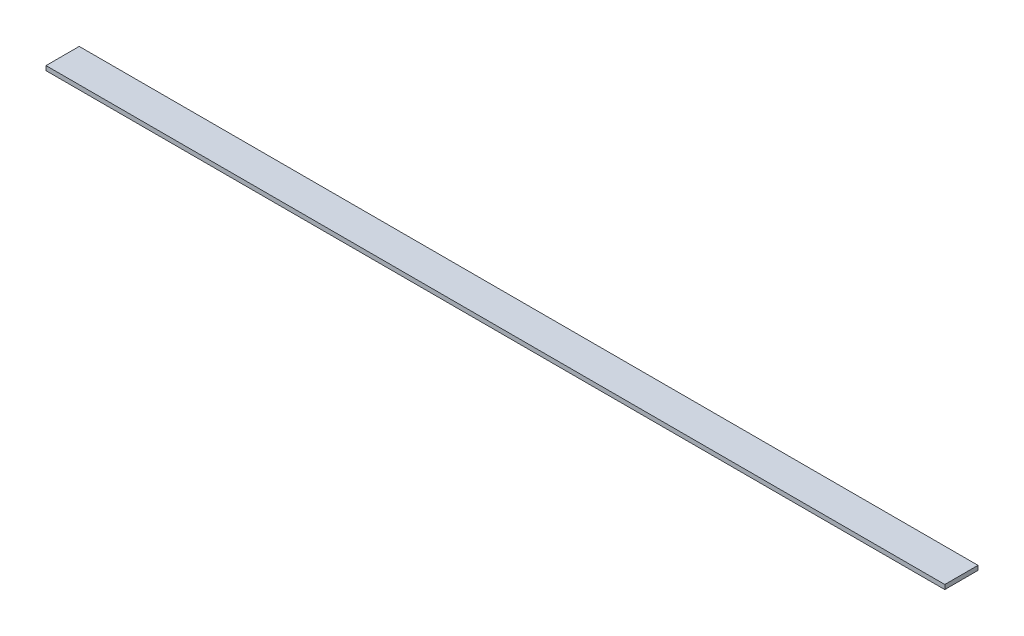
ISO-10303-21;
HEADER;
FILE_DESCRIPTION(('STEP AP214'),'2;1');
FILE_NAME('part.step','',(''),(''),'','','');
FILE_SCHEMA(('AUTOMOTIVE_DESIGN { 1 0 10303 214 1 1 1 1 }'));
ENDSEC;
DATA;
#1=APPLICATION_CONTEXT('core data for automotive mechanical design processes');
#2=APPLICATION_PROTOCOL_DEFINITION('international standard','automotive_design',2000,#1);
#3=PRODUCT_CONTEXT('',#1,'mechanical');
#4=PRODUCT('Part','Part','',(#3));
#5=PRODUCT_RELATED_PRODUCT_CATEGORY('part','',(#4));
#6=PRODUCT_DEFINITION_FORMATION('','',#4);
#7=PRODUCT_DEFINITION_CONTEXT('part definition',#1,'design');
#8=PRODUCT_DEFINITION('design','',#6,#7);
#9=PRODUCT_DEFINITION_SHAPE('','',#8);
#10=(LENGTH_UNIT() NAMED_UNIT(*) SI_UNIT(.MILLI.,.METRE.));
#11=(NAMED_UNIT(*) PLANE_ANGLE_UNIT() SI_UNIT($,.RADIAN.));
#12=(NAMED_UNIT(*) SI_UNIT($,.STERADIAN.) SOLID_ANGLE_UNIT());
#13=UNCERTAINTY_MEASURE_WITH_UNIT(LENGTH_MEASURE(1.E-05),#10,'distance_accuracy_value','');
#14=(GEOMETRIC_REPRESENTATION_CONTEXT(3) GLOBAL_UNCERTAINTY_ASSIGNED_CONTEXT((#13)) GLOBAL_UNIT_ASSIGNED_CONTEXT((#10,
#11,#12)) REPRESENTATION_CONTEXT('',''));
#15=CARTESIAN_POINT('',(0.,0.,0.));
#16=DIRECTION('',(0.,0.,1.));
#17=DIRECTION('',(1.,0.,0.));
#18=AXIS2_PLACEMENT_3D('',#15,#16,#17);
#19=CARTESIAN_POINT('',(-406.,0.,0.));
#20=DIRECTION('',(0.,0.,1.));
#21=DIRECTION('',(1.,0.,0.));
#22=AXIS2_PLACEMENT_3D('',#19,#20,#21);
#23=PLANE('',#22);
#24=DIRECTION('',(0.,-1.,0.));
#25=VECTOR('',#24,1.);
#26=CARTESIAN_POINT('',(0.,0.,0.));
#27=LINE('',#26,#25);
#28=CARTESIAN_POINT('',(0.,2.,0.));
#29=VERTEX_POINT('',#28);
#30=CARTESIAN_POINT('',(0.,0.,0.));
#31=VERTEX_POINT('',#30);
#32=EDGE_CURVE('E101',#29,#31,#27,.T.);
#33=ORIENTED_EDGE('',*,*,#32,.F.);
#34=DIRECTION('',(1.,0.,0.));
#35=VECTOR('',#34,1.);
#36=CARTESIAN_POINT('',(-406.,2.,0.));
#37=LINE('',#36,#35);
#38=CARTESIAN_POINT('',(-406.,2.,0.));
#39=VERTEX_POINT('',#38);
#40=EDGE_CURVE('E11',#39,#29,#37,.T.);
#41=ORIENTED_EDGE('',*,*,#40,.F.);
#42=DIRECTION('',(0.,-1.,0.));
#43=VECTOR('',#42,1.);
#44=CARTESIAN_POINT('',(-406.,0.,0.));
#45=LINE('',#44,#43);
#46=CARTESIAN_POINT('',(-406.,0.,0.));
#47=VERTEX_POINT('',#46);
#48=EDGE_CURVE('E95',#39,#47,#45,.T.);
#49=ORIENTED_EDGE('',*,*,#48,.T.);
#50=DIRECTION('',(1.,0.,0.));
#51=VECTOR('',#50,1.);
#52=CARTESIAN_POINT('',(-406.,0.,0.));
#53=LINE('',#52,#51);
#54=EDGE_CURVE('E40',#47,#31,#53,.T.);
#55=ORIENTED_EDGE('',*,*,#54,.T.);
#56=EDGE_LOOP('',(#33,#41,#49,#55));
#57=FACE_BOUND('',#56,.T.);
#58=ADVANCED_FACE('F37',(#57),#23,.T.);
#59=CARTESIAN_POINT('',(-406.,2.,0.));
#60=DIRECTION('',(0.,1.,0.));
#61=DIRECTION('',(0.,0.,1.));
#62=AXIS2_PLACEMENT_3D('',#59,#60,#61);
#63=PLANE('',#62);
#64=DIRECTION('',(0.,0.,1.));
#65=VECTOR('',#64,1.);
#66=CARTESIAN_POINT('',(0.,2.,0.));
#67=LINE('',#66,#65);
#68=CARTESIAN_POINT('',(0.,2.,-15.));
#69=VERTEX_POINT('',#68);
#70=EDGE_CURVE('E97',#69,#29,#67,.T.);
#71=ORIENTED_EDGE('',*,*,#70,.F.);
#72=DIRECTION('',(1.,0.,0.));
#73=VECTOR('',#72,1.);
#74=CARTESIAN_POINT('',(-406.,2.,-15.));
#75=LINE('',#74,#73);
#76=CARTESIAN_POINT('',(-406.,2.,-15.));
#77=VERTEX_POINT('',#76);
#78=EDGE_CURVE('E46',#77,#69,#75,.T.);
#79=ORIENTED_EDGE('',*,*,#78,.F.);
#80=DIRECTION('',(0.,0.,1.));
#81=VECTOR('',#80,1.);
#82=CARTESIAN_POINT('',(-406.,2.,0.));
#83=LINE('',#82,#81);
#84=EDGE_CURVE('E92',#77,#39,#83,.T.);
#85=ORIENTED_EDGE('',*,*,#84,.T.);
#86=ORIENTED_EDGE('',*,*,#40,.T.);
#87=EDGE_LOOP('',(#71,#79,#85,#86));
#88=FACE_BOUND('',#87,.T.);
#89=ADVANCED_FACE('F111',(#88),#63,.T.);
#90=CARTESIAN_POINT('',(-406.,0.,-15.));
#91=DIRECTION('',(0.,0.,-1.));
#92=DIRECTION('',(-1.,0.,0.));
#93=AXIS2_PLACEMENT_3D('',#90,#91,#92);
#94=PLANE('',#93);
#95=DIRECTION('',(0.,1.,0.));
#96=VECTOR('',#95,1.);
#97=CARTESIAN_POINT('',(0.,0.,-15.));
#98=LINE('',#97,#96);
#99=CARTESIAN_POINT('',(0.,0.,-15.));
#100=VERTEX_POINT('',#99);
#101=EDGE_CURVE('E87',#100,#69,#98,.T.);
#102=ORIENTED_EDGE('',*,*,#101,.F.);
#103=DIRECTION('',(1.,0.,0.));
#104=VECTOR('',#103,1.);
#105=CARTESIAN_POINT('',(-406.,0.,-15.));
#106=LINE('',#105,#104);
#107=CARTESIAN_POINT('',(-406.,0.,-15.));
#108=VERTEX_POINT('',#107);
#109=EDGE_CURVE('E82',#108,#100,#106,.T.);
#110=ORIENTED_EDGE('',*,*,#109,.F.);
#111=DIRECTION('',(0.,1.,0.));
#112=VECTOR('',#111,1.);
#113=CARTESIAN_POINT('',(-406.,0.,-15.));
#114=LINE('',#113,#112);
#115=EDGE_CURVE('E85',#108,#77,#114,.T.);
#116=ORIENTED_EDGE('',*,*,#115,.T.);
#117=ORIENTED_EDGE('',*,*,#78,.T.);
#118=EDGE_LOOP('',(#102,#110,#116,#117));
#119=FACE_BOUND('',#118,.T.);
#120=ADVANCED_FACE('F84',(#119),#94,.T.);
#121=CARTESIAN_POINT('',(-406.,0.,0.));
#122=DIRECTION('',(0.,-1.,0.));
#123=DIRECTION('',(0.,0.,-1.));
#124=AXIS2_PLACEMENT_3D('',#121,#122,#123);
#125=PLANE('',#124);
#126=DIRECTION('',(0.,0.,-1.));
#127=VECTOR('',#126,1.);
#128=CARTESIAN_POINT('',(0.,0.,0.));
#129=LINE('',#128,#127);
#130=EDGE_CURVE('E104',#31,#100,#129,.T.);
#131=ORIENTED_EDGE('',*,*,#130,.F.);
#132=ORIENTED_EDGE('',*,*,#54,.F.);
#133=DIRECTION('',(0.,0.,-1.));
#134=VECTOR('',#133,1.);
#135=CARTESIAN_POINT('',(-406.,0.,0.));
#136=LINE('',#135,#134);
#137=EDGE_CURVE('E91',#47,#108,#136,.T.);
#138=ORIENTED_EDGE('',*,*,#137,.T.);
#139=ORIENTED_EDGE('',*,*,#109,.T.);
#140=EDGE_LOOP('',(#131,#132,#138,#139));
#141=FACE_BOUND('',#140,.T.);
#142=ADVANCED_FACE('F94',(#141),#125,.T.);
#143=CARTESIAN_POINT('',(-406.,0.,0.));
#144=DIRECTION('',(-1.,0.,0.));
#145=DIRECTION('',(0.,0.,1.));
#146=AXIS2_PLACEMENT_3D('',#143,#144,#145);
#147=PLANE('',#146);
#148=ORIENTED_EDGE('',*,*,#48,.F.);
#149=ORIENTED_EDGE('',*,*,#84,.F.);
#150=ORIENTED_EDGE('',*,*,#115,.F.);
#151=ORIENTED_EDGE('',*,*,#137,.F.);
#152=EDGE_LOOP('',(#148,#149,#150,#151));
#153=FACE_BOUND('',#152,.T.);
#154=ADVANCED_FACE('F90',(#153),#147,.T.);
#155=CARTESIAN_POINT('',(0.,0.,0.));
#156=DIRECTION('',(-1.,0.,0.));
#157=DIRECTION('',(0.,0.,1.));
#158=AXIS2_PLACEMENT_3D('',#155,#156,#157);
#159=PLANE('',#158);
#160=ORIENTED_EDGE('',*,*,#32,.T.);
#161=ORIENTED_EDGE('',*,*,#130,.T.);
#162=ORIENTED_EDGE('',*,*,#101,.T.);
#163=ORIENTED_EDGE('',*,*,#70,.T.);
#164=EDGE_LOOP('',(#160,#161,#162,#163));
#165=FACE_BOUND('',#164,.T.);
#166=ADVANCED_FACE('F110',(#165),#159,.F.);
#167=CLOSED_SHELL('',(#58,#89,#120,#142,#154,#166));
#168=MANIFOLD_SOLID_BREP('B2',#167);
#169=ADVANCED_BREP_SHAPE_REPRESENTATION('',(#18,#168),#14);
#170=SHAPE_DEFINITION_REPRESENTATION(#9,#169);
ENDSEC;
END-ISO-10303-21;
